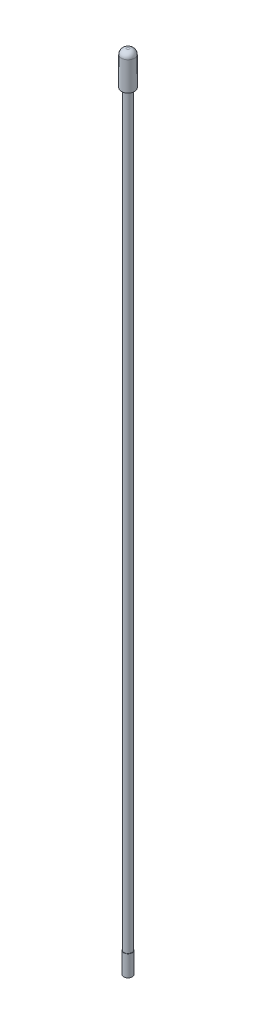
ISO-10303-21;
HEADER;
FILE_DESCRIPTION(('STEP AP214'),'2;1');
FILE_NAME('part.step','',(''),(''),'','','');
FILE_SCHEMA(('AUTOMOTIVE_DESIGN { 1 0 10303 214 1 1 1 1 }'));
ENDSEC;
DATA;
#1=APPLICATION_CONTEXT('core data for automotive mechanical design processes');
#2=APPLICATION_PROTOCOL_DEFINITION('international standard','automotive_design',2000,#1);
#3=PRODUCT_CONTEXT('',#1,'mechanical');
#4=PRODUCT('Part','Part','',(#3));
#5=PRODUCT_RELATED_PRODUCT_CATEGORY('part','',(#4));
#6=PRODUCT_DEFINITION_FORMATION('','',#4);
#7=PRODUCT_DEFINITION_CONTEXT('part definition',#1,'design');
#8=PRODUCT_DEFINITION('design','',#6,#7);
#9=PRODUCT_DEFINITION_SHAPE('','',#8);
#10=(LENGTH_UNIT() NAMED_UNIT(*) SI_UNIT(.MILLI.,.METRE.));
#11=(NAMED_UNIT(*) PLANE_ANGLE_UNIT() SI_UNIT($,.RADIAN.));
#12=(NAMED_UNIT(*) SI_UNIT($,.STERADIAN.) SOLID_ANGLE_UNIT());
#13=UNCERTAINTY_MEASURE_WITH_UNIT(LENGTH_MEASURE(1.E-05),#10,'distance_accuracy_value','');
#14=(GEOMETRIC_REPRESENTATION_CONTEXT(3) GLOBAL_UNCERTAINTY_ASSIGNED_CONTEXT((#13)) GLOBAL_UNIT_ASSIGNED_CONTEXT((#10,
#11,#12)) REPRESENTATION_CONTEXT('',''));
#15=CARTESIAN_POINT('',(0.,0.,0.));
#16=DIRECTION('',(0.,0.,1.));
#17=DIRECTION('',(1.,0.,0.));
#18=AXIS2_PLACEMENT_3D('',#15,#16,#17);
#19=CARTESIAN_POINT('',(0.,8.,0.));
#20=DIRECTION('',(0.,-1.,0.));
#21=DIRECTION('',(0.,0.,-1.));
#22=AXIS2_PLACEMENT_3D('',#19,#20,#21);
#23=CYLINDRICAL_SURFACE('',#22,1.625);
#24=CARTESIAN_POINT('',(0.,8.,0.));
#25=DIRECTION('',(0.,1.,0.));
#26=DIRECTION('',(0.,0.,1.));
#27=AXIS2_PLACEMENT_3D('',#24,#25,#26);
#28=CIRCLE('',#27,1.625);
#29=CARTESIAN_POINT('',(0.,8.,1.625));
#30=VERTEX_POINT('',#29);
#31=EDGE_CURVE('E46',#30,#30,#28,.T.);
#32=ORIENTED_EDGE('',*,*,#31,.F.);
#33=EDGE_LOOP('',(#32));
#34=FACE_BOUND('',#33,.T.);
#35=CARTESIAN_POINT('',(0.,0.,0.));
#36=DIRECTION('',(0.,1.,0.));
#37=DIRECTION('',(0.,0.,1.));
#38=AXIS2_PLACEMENT_3D('',#35,#36,#37);
#39=CIRCLE('',#38,1.625);
#40=CARTESIAN_POINT('',(0.,0.,1.625));
#41=VERTEX_POINT('',#40);
#42=EDGE_CURVE('E50',#41,#41,#39,.T.);
#43=ORIENTED_EDGE('',*,*,#42,.T.);
#44=EDGE_LOOP('',(#43));
#45=FACE_BOUND('',#44,.T.);
#46=ADVANCED_FACE('F35',(#34,#45),#23,.T.);
#47=CARTESIAN_POINT('',(0.,8.,0.));
#48=DIRECTION('',(0.,1.,0.));
#49=DIRECTION('',(0.,0.,1.));
#50=AXIS2_PLACEMENT_3D('',#47,#48,#49);
#51=PLANE('',#50);
#52=CARTESIAN_POINT('',(0.,8.,0.));
#53=DIRECTION('',(0.,1.,0.));
#54=DIRECTION('',(0.,0.,1.));
#55=AXIS2_PLACEMENT_3D('',#52,#53,#54);
#56=CIRCLE('',#55,1.5);
#57=CARTESIAN_POINT('',(0.,8.,1.5));
#58=VERTEX_POINT('',#57);
#59=EDGE_CURVE('E56',#58,#58,#56,.T.);
#60=ORIENTED_EDGE('',*,*,#59,.F.);
#61=EDGE_LOOP('',(#60));
#62=FACE_BOUND('',#61,.T.);
#63=ORIENTED_EDGE('',*,*,#31,.T.);
#64=EDGE_LOOP('',(#63));
#65=FACE_BOUND('',#64,.T.);
#66=ADVANCED_FACE('F80',(#62,#65),#51,.T.);
#67=CARTESIAN_POINT('',(0.,0.,0.));
#68=DIRECTION('',(0.,1.,0.));
#69=DIRECTION('',(0.,0.,1.));
#70=AXIS2_PLACEMENT_3D('',#67,#68,#69);
#71=PLANE('',#70);
#72=ORIENTED_EDGE('',*,*,#42,.F.);
#73=EDGE_LOOP('',(#72));
#74=FACE_BOUND('',#73,.T.);
#75=ADVANCED_FACE('F85',(#74),#71,.F.);
#76=CARTESIAN_POINT('',(0.,293.,0.));
#77=DIRECTION('',(0.,-1.,0.));
#78=DIRECTION('',(0.,0.,-1.));
#79=AXIS2_PLACEMENT_3D('',#76,#77,#78);
#80=CYLINDRICAL_SURFACE('',#79,1.5);
#81=CARTESIAN_POINT('',(0.,293.,0.));
#82=DIRECTION('',(0.,1.,0.));
#83=DIRECTION('',(0.,0.,1.));
#84=AXIS2_PLACEMENT_3D('',#81,#82,#83);
#85=CIRCLE('',#84,1.5);
#86=CARTESIAN_POINT('',(0.,293.,1.5));
#87=VERTEX_POINT('',#86);
#88=EDGE_CURVE('E54',#87,#87,#85,.T.);
#89=ORIENTED_EDGE('',*,*,#88,.F.);
#90=EDGE_LOOP('',(#89));
#91=FACE_BOUND('',#90,.T.);
#92=ORIENTED_EDGE('',*,*,#59,.T.);
#93=EDGE_LOOP('',(#92));
#94=FACE_BOUND('',#93,.T.);
#95=ADVANCED_FACE('F92',(#91,#94),#80,.T.);
#96=CARTESIAN_POINT('',(0.,306.,0.));
#97=DIRECTION('',(0.,-1.,0.));
#98=DIRECTION('',(0.,0.,-1.));
#99=AXIS2_PLACEMENT_3D('',#96,#97,#98);
#100=CYLINDRICAL_SURFACE('',#99,2.5);
#101=CARTESIAN_POINT('',(0.,304.,0.));
#102=DIRECTION('',(0.,1.,0.));
#103=DIRECTION('',(0.,0.,1.));
#104=AXIS2_PLACEMENT_3D('',#101,#102,#103);
#105=CIRCLE('',#104,2.5);
#106=CARTESIAN_POINT('',(0.,304.,2.5));
#107=VERTEX_POINT('',#106);
#108=EDGE_CURVE('E10',#107,#107,#105,.F.);
#109=ORIENTED_EDGE('',*,*,#108,.T.);
#110=EDGE_LOOP('',(#109));
#111=FACE_BOUND('',#110,.T.);
#112=CARTESIAN_POINT('',(0.,293.,0.));
#113=DIRECTION('',(0.,1.,0.));
#114=DIRECTION('',(0.,0.,1.));
#115=AXIS2_PLACEMENT_3D('',#112,#113,#114);
#116=CIRCLE('',#115,2.5);
#117=CARTESIAN_POINT('',(0.,293.,2.5));
#118=VERTEX_POINT('',#117);
#119=EDGE_CURVE('E59',#118,#118,#116,.T.);
#120=ORIENTED_EDGE('',*,*,#119,.T.);
#121=EDGE_LOOP('',(#120));
#122=FACE_BOUND('',#121,.T.);
#123=ADVANCED_FACE('F65',(#111,#122),#100,.T.);
#124=CARTESIAN_POINT('',(0.,306.,0.));
#125=DIRECTION('',(0.,1.,0.));
#126=DIRECTION('',(0.,0.,1.));
#127=AXIS2_PLACEMENT_3D('',#124,#125,#126);
#128=PLANE('',#127);
#129=CARTESIAN_POINT('',(0.,306.,0.));
#130=DIRECTION('',(0.,1.,0.));
#131=DIRECTION('',(0.,0.,1.));
#132=AXIS2_PLACEMENT_3D('',#129,#130,#131);
#133=CIRCLE('',#132,0.5);
#134=CARTESIAN_POINT('',(0.,306.,0.5));
#135=VERTEX_POINT('',#134);
#136=EDGE_CURVE('E42',#135,#135,#133,.T.);
#137=ORIENTED_EDGE('',*,*,#136,.T.);
#138=EDGE_LOOP('',(#137));
#139=FACE_BOUND('',#138,.T.);
#140=ADVANCED_FACE('F69',(#139),#128,.T.);
#141=CARTESIAN_POINT('',(0.,293.,0.));
#142=DIRECTION('',(0.,1.,0.));
#143=DIRECTION('',(0.,0.,1.));
#144=AXIS2_PLACEMENT_3D('',#141,#142,#143);
#145=PLANE('',#144);
#146=ORIENTED_EDGE('',*,*,#88,.T.);
#147=EDGE_LOOP('',(#146));
#148=FACE_BOUND('',#147,.T.);
#149=ORIENTED_EDGE('',*,*,#119,.F.);
#150=EDGE_LOOP('',(#149));
#151=FACE_BOUND('',#150,.T.);
#152=ADVANCED_FACE('F67',(#148,#151),#145,.F.);
#153=CARTESIAN_POINT('',(0.,304.,0.));
#154=DIRECTION('',(0.,1.,0.));
#155=DIRECTION('',(0.,0.,1.));
#156=AXIS2_PLACEMENT_3D('',#153,#154,#155);
#157=DEGENERATE_TOROIDAL_SURFACE('',#156,0.5,2.,.T.);
#158=ORIENTED_EDGE('',*,*,#108,.F.);
#159=EDGE_LOOP('',(#158));
#160=FACE_BOUND('',#159,.T.);
#161=ORIENTED_EDGE('',*,*,#136,.F.);
#162=EDGE_LOOP('',(#161));
#163=FACE_BOUND('',#162,.T.);
#164=ADVANCED_FACE('F37',(#160,#163),#157,.T.);
#165=CLOSED_SHELL('',(#46,#66,#75,#95,#123,#140,#152,#164));
#166=MANIFOLD_SOLID_BREP('B2',#165);
#167=ADVANCED_BREP_SHAPE_REPRESENTATION('',(#18,#166),#14);
#168=SHAPE_DEFINITION_REPRESENTATION(#9,#167);
ENDSEC;
END-ISO-10303-21;
